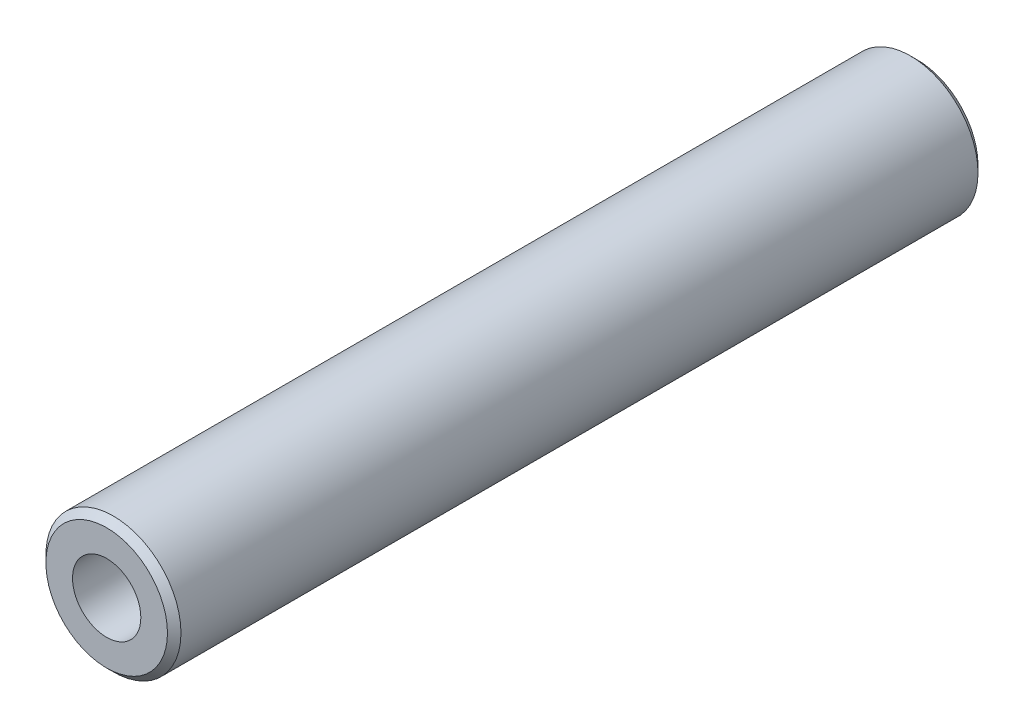
ISO-10303-21;
HEADER;
FILE_DESCRIPTION(('STEP AP214'),'2;1');
FILE_NAME('part.step','',(''),(''),'','','');
FILE_SCHEMA(('AUTOMOTIVE_DESIGN { 1 0 10303 214 1 1 1 1 }'));
ENDSEC;
DATA;
#1=APPLICATION_CONTEXT('core data for automotive mechanical design processes');
#2=APPLICATION_PROTOCOL_DEFINITION('international standard','automotive_design',2000,#1);
#3=PRODUCT_CONTEXT('',#1,'mechanical');
#4=PRODUCT('Part','Part','',(#3));
#5=PRODUCT_RELATED_PRODUCT_CATEGORY('part','',(#4));
#6=PRODUCT_DEFINITION_FORMATION('','',#4);
#7=PRODUCT_DEFINITION_CONTEXT('part definition',#1,'design');
#8=PRODUCT_DEFINITION('design','',#6,#7);
#9=PRODUCT_DEFINITION_SHAPE('','',#8);
#10=(LENGTH_UNIT() NAMED_UNIT(*) SI_UNIT(.MILLI.,.METRE.));
#11=(NAMED_UNIT(*) PLANE_ANGLE_UNIT() SI_UNIT($,.RADIAN.));
#12=(NAMED_UNIT(*) SI_UNIT($,.STERADIAN.) SOLID_ANGLE_UNIT());
#13=UNCERTAINTY_MEASURE_WITH_UNIT(LENGTH_MEASURE(1.E-05),#10,'distance_accuracy_value','');
#14=(GEOMETRIC_REPRESENTATION_CONTEXT(3) GLOBAL_UNCERTAINTY_ASSIGNED_CONTEXT((#13)) GLOBAL_UNIT_ASSIGNED_CONTEXT((#10,
#11,#12)) REPRESENTATION_CONTEXT('',''));
#15=CARTESIAN_POINT('',(0.,0.,0.));
#16=DIRECTION('',(0.,0.,1.));
#17=DIRECTION('',(1.,0.,0.));
#18=AXIS2_PLACEMENT_3D('',#15,#16,#17);
#19=CARTESIAN_POINT('',(32.7499999916141,51.4500000000046,14.5));
#20=DIRECTION('',(0.,0.,-1.));
#21=DIRECTION('',(-1.,0.,0.));
#22=AXIS2_PLACEMENT_3D('',#19,#20,#21);
#23=CYLINDRICAL_SURFACE('',#22,1.2645);
#24=CARTESIAN_POINT('',(32.7499999916141,51.4500000000046,-15.5));
#25=DIRECTION('',(0.,0.,1.));
#26=DIRECTION('',(-1.,0.,0.));
#27=AXIS2_PLACEMENT_3D('',#24,#25,#26);
#28=CIRCLE('',#27,1.2645);
#29=CARTESIAN_POINT('',(34.0144999916141,51.4500000000046,-15.5));
#30=VERTEX_POINT('',#29);
#31=EDGE_CURVE('E26',#30,#30,#28,.T.);
#32=ORIENTED_EDGE('',*,*,#31,.F.);
#33=DIRECTION('',(0.,0.,1.));
#34=VECTOR('',#33,1.);
#35=CARTESIAN_POINT('',(34.0144999916141,51.4500000000046,14.5));
#36=LINE('',#35,#34);
#37=CARTESIAN_POINT('',(34.0144999916141,51.4500000000046,14.5));
#38=VERTEX_POINT('',#37);
#39=EDGE_CURVE('E11',#30,#38,#36,.T.);
#40=ORIENTED_EDGE('',*,*,#39,.T.);
#41=CARTESIAN_POINT('',(32.7499999916141,51.4500000000046,14.5));
#42=DIRECTION('',(0.,0.,1.));
#43=DIRECTION('',(-1.,0.,0.));
#44=AXIS2_PLACEMENT_3D('',#41,#42,#43);
#45=CIRCLE('',#44,1.2645);
#46=EDGE_CURVE('E72',#38,#38,#45,.T.);
#47=ORIENTED_EDGE('',*,*,#46,.T.);
#48=ORIENTED_EDGE('',*,*,#39,.F.);
#49=EDGE_LOOP('',(#32,#40,#47,#48));
#50=FACE_BOUND('',#49,.T.);
#51=ADVANCED_FACE('F17',(#50),#23,.F.);
#52=CARTESIAN_POINT('',(39.5000000000009,72.8949999999916,-15.5));
#53=DIRECTION('',(0.,0.,1.));
#54=DIRECTION('',(1.,0.,0.));
#55=AXIS2_PLACEMENT_3D('',#52,#53,#54);
#56=PLANE('',#55);
#57=ORIENTED_EDGE('',*,*,#31,.T.);
#58=EDGE_LOOP('',(#57));
#59=FACE_BOUND('',#58,.T.);
#60=CARTESIAN_POINT('',(32.7499999916141,51.4500000000046,-15.5));
#61=DIRECTION('',(0.,0.,1.));
#62=DIRECTION('',(-1.,0.,0.));
#63=AXIS2_PLACEMENT_3D('',#60,#61,#62);
#64=CIRCLE('',#63,2.25);
#65=CARTESIAN_POINT('',(34.9999999916141,51.4500000000046,-15.5));
#66=VERTEX_POINT('',#65);
#67=EDGE_CURVE('E20',#66,#66,#64,.T.);
#68=ORIENTED_EDGE('',*,*,#67,.F.);
#69=EDGE_LOOP('',(#68));
#70=FACE_BOUND('',#69,.T.);
#71=ADVANCED_FACE('F149',(#59,#70),#56,.F.);
#72=CARTESIAN_POINT('',(32.7499999916141,51.4500000000046,-15.375));
#73=DIRECTION('',(0.,0.,1.));
#74=DIRECTION('',(-1.,0.,0.));
#75=AXIS2_PLACEMENT_3D('',#72,#73,#74);
#76=CONICAL_SURFACE('',#75,2.375,0.785398163397444);
#77=CARTESIAN_POINT('',(32.7499999916141,51.4500000000046,-15.25));
#78=DIRECTION('',(0.,0.,-1.));
#79=DIRECTION('',(-1.,0.,0.));
#80=AXIS2_PLACEMENT_3D('',#77,#78,#79);
#81=CIRCLE('',#80,2.5);
#82=CARTESIAN_POINT('',(35.2499999916141,51.4500000000046,-15.25));
#83=VERTEX_POINT('',#82);
#84=EDGE_CURVE('E70',#83,#83,#81,.T.);
#85=ORIENTED_EDGE('',*,*,#84,.T.);
#86=DIRECTION('',(-0.707106781186544,0.,-0.707106781186551));
#87=VECTOR('',#86,1.);
#88=CARTESIAN_POINT('',(35.1249999916141,51.4500000000046,-15.375));
#89=LINE('',#88,#87);
#90=EDGE_CURVE('E96',#83,#66,#89,.T.);
#91=ORIENTED_EDGE('',*,*,#90,.T.);
#92=ORIENTED_EDGE('',*,*,#67,.T.);
#93=ORIENTED_EDGE('',*,*,#90,.F.);
#94=EDGE_LOOP('',(#85,#91,#92,#93));
#95=FACE_BOUND('',#94,.T.);
#96=ADVANCED_FACE('F139',(#95),#76,.T.);
#97=CARTESIAN_POINT('',(39.5000000000009,72.8949999999916,14.5));
#98=DIRECTION('',(0.,0.,1.));
#99=DIRECTION('',(1.,0.,0.));
#100=AXIS2_PLACEMENT_3D('',#97,#98,#99);
#101=PLANE('',#100);
#102=ORIENTED_EDGE('',*,*,#46,.F.);
#103=EDGE_LOOP('',(#102));
#104=FACE_BOUND('',#103,.T.);
#105=CARTESIAN_POINT('',(32.7499999916141,51.4500000000046,14.5));
#106=DIRECTION('',(0.,0.,-1.));
#107=DIRECTION('',(-1.,0.,0.));
#108=AXIS2_PLACEMENT_3D('',#105,#106,#107);
#109=CIRCLE('',#108,2.25);
#110=CARTESIAN_POINT('',(34.9999999916141,51.4500000000046,14.5));
#111=VERTEX_POINT('',#110);
#112=EDGE_CURVE('E79',#111,#111,#109,.T.);
#113=ORIENTED_EDGE('',*,*,#112,.F.);
#114=EDGE_LOOP('',(#113));
#115=FACE_BOUND('',#114,.T.);
#116=ADVANCED_FACE('F129',(#104,#115),#101,.T.);
#117=CARTESIAN_POINT('',(32.7499999916141,51.4500000000046,14.5));
#118=DIRECTION('',(0.,0.,-1.));
#119=DIRECTION('',(-1.,0.,0.));
#120=AXIS2_PLACEMENT_3D('',#117,#118,#119);
#121=CYLINDRICAL_SURFACE('',#120,2.5);
#122=ORIENTED_EDGE('',*,*,#84,.F.);
#123=DIRECTION('',(0.,0.,1.));
#124=VECTOR('',#123,1.);
#125=CARTESIAN_POINT('',(35.2499999916141,51.4500000000046,14.5));
#126=LINE('',#125,#124);
#127=CARTESIAN_POINT('',(35.2499999916141,51.4500000000046,14.25));
#128=VERTEX_POINT('',#127);
#129=EDGE_CURVE('E64',#83,#128,#126,.T.);
#130=ORIENTED_EDGE('',*,*,#129,.T.);
#131=CARTESIAN_POINT('',(32.7499999916141,51.4500000000046,14.25));
#132=DIRECTION('',(0.,0.,1.));
#133=DIRECTION('',(-1.,0.,0.));
#134=AXIS2_PLACEMENT_3D('',#131,#132,#133);
#135=CIRCLE('',#134,2.5);
#136=EDGE_CURVE('E68',#128,#128,#135,.T.);
#137=ORIENTED_EDGE('',*,*,#136,.F.);
#138=ORIENTED_EDGE('',*,*,#129,.F.);
#139=EDGE_LOOP('',(#122,#130,#137,#138));
#140=FACE_BOUND('',#139,.T.);
#141=ADVANCED_FACE('F66',(#140),#121,.T.);
#142=CARTESIAN_POINT('',(32.7499999916141,51.4500000000046,14.375));
#143=DIRECTION('',(0.,0.,-1.));
#144=DIRECTION('',(-1.,0.,0.));
#145=AXIS2_PLACEMENT_3D('',#142,#143,#144);
#146=CONICAL_SURFACE('',#145,2.375,0.785398163397448);
#147=ORIENTED_EDGE('',*,*,#136,.T.);
#148=DIRECTION('',(-0.707106781186548,0.,0.707106781186548));
#149=VECTOR('',#148,1.);
#150=CARTESIAN_POINT('',(35.1249999916141,51.4500000000046,14.375));
#151=LINE('',#150,#149);
#152=EDGE_CURVE('E76',#128,#111,#151,.T.);
#153=ORIENTED_EDGE('',*,*,#152,.T.);
#154=ORIENTED_EDGE('',*,*,#112,.T.);
#155=ORIENTED_EDGE('',*,*,#152,.F.);
#156=EDGE_LOOP('',(#147,#153,#154,#155));
#157=FACE_BOUND('',#156,.T.);
#158=ADVANCED_FACE('F77',(#157),#146,.T.);
#159=CLOSED_SHELL('',(#51,#71,#96,#116,#141,#158));
#160=MANIFOLD_SOLID_BREP('B1',#159);
#161=ADVANCED_BREP_SHAPE_REPRESENTATION('',(#18,#160),#14);
#162=SHAPE_DEFINITION_REPRESENTATION(#9,#161);
ENDSEC;
END-ISO-10303-21;
